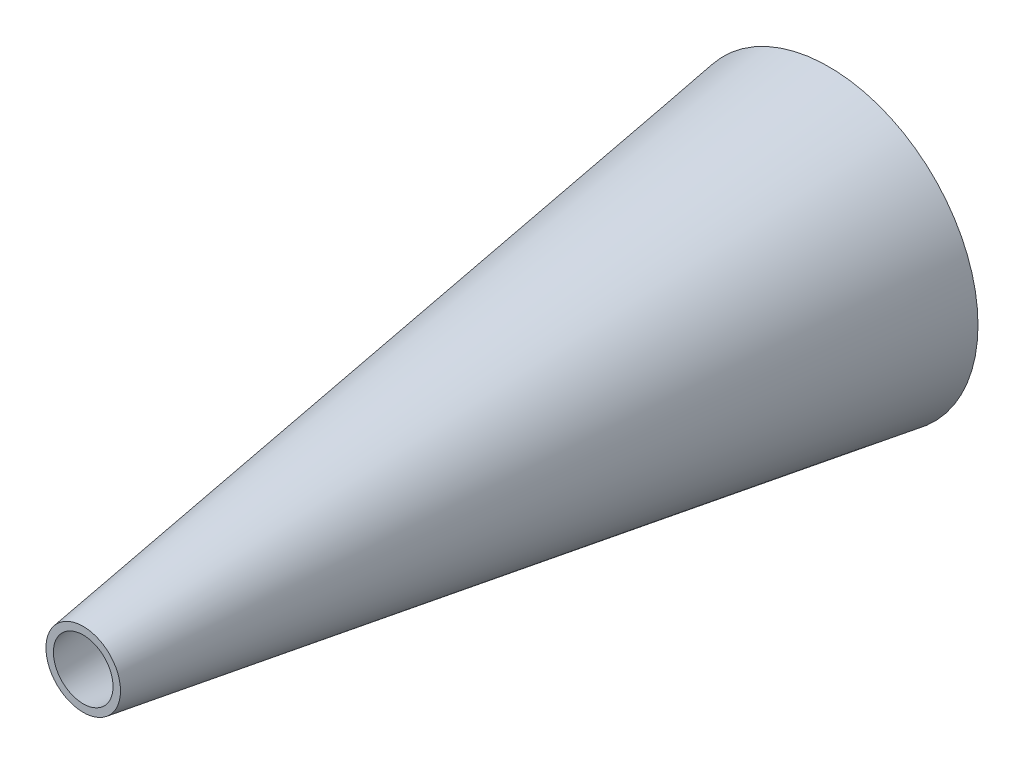
ISO-10303-21;
HEADER;
FILE_DESCRIPTION(('STEP AP214'),'2;1');
FILE_NAME('part.step','',(''),(''),'','','');
FILE_SCHEMA(('AUTOMOTIVE_DESIGN { 1 0 10303 214 1 1 1 1 }'));
ENDSEC;
DATA;
#1=APPLICATION_CONTEXT('core data for automotive mechanical design processes');
#2=APPLICATION_PROTOCOL_DEFINITION('international standard','automotive_design',2000,#1);
#3=PRODUCT_CONTEXT('',#1,'mechanical');
#4=PRODUCT('Part','Part','',(#3));
#5=PRODUCT_RELATED_PRODUCT_CATEGORY('part','',(#4));
#6=PRODUCT_DEFINITION_FORMATION('','',#4);
#7=PRODUCT_DEFINITION_CONTEXT('part definition',#1,'design');
#8=PRODUCT_DEFINITION('design','',#6,#7);
#9=PRODUCT_DEFINITION_SHAPE('','',#8);
#10=(LENGTH_UNIT() NAMED_UNIT(*) SI_UNIT(.MILLI.,.METRE.));
#11=(NAMED_UNIT(*) PLANE_ANGLE_UNIT() SI_UNIT($,.RADIAN.));
#12=(NAMED_UNIT(*) SI_UNIT($,.STERADIAN.) SOLID_ANGLE_UNIT());
#13=UNCERTAINTY_MEASURE_WITH_UNIT(LENGTH_MEASURE(1.E-05),#10,'distance_accuracy_value','');
#14=(GEOMETRIC_REPRESENTATION_CONTEXT(3) GLOBAL_UNCERTAINTY_ASSIGNED_CONTEXT((#13)) GLOBAL_UNIT_ASSIGNED_CONTEXT((#10,
#11,#12)) REPRESENTATION_CONTEXT('',''));
#15=CARTESIAN_POINT('',(0.,0.,0.));
#16=DIRECTION('',(0.,0.,1.));
#17=DIRECTION('',(1.,0.,0.));
#18=AXIS2_PLACEMENT_3D('',#15,#16,#17);
#19=CARTESIAN_POINT('',(0.,0.,500.));
#20=DIRECTION('',(0.,0.,-1.));
#21=DIRECTION('',(-1.,0.,0.));
#22=AXIS2_PLACEMENT_3D('',#19,#20,#21);
#23=CONICAL_SURFACE('',#22,20.,0.139095941482071);
#24=CARTESIAN_POINT('',(0.,0.,500.));
#25=DIRECTION('',(0.,0.,-1.));
#26=DIRECTION('',(1.,0.,0.));
#27=AXIS2_PLACEMENT_3D('',#24,#25,#26);
#28=CIRCLE('',#27,20.);
#29=CARTESIAN_POINT('',(20.,0.,500.));
#30=VERTEX_POINT('',#29);
#31=EDGE_CURVE('E26',#30,#30,#28,.T.);
#32=ORIENTED_EDGE('',*,*,#31,.F.);
#33=EDGE_LOOP('',(#32));
#34=FACE_BOUND('',#33,.T.);
#35=CARTESIAN_POINT('',(0.,0.,0.));
#36=DIRECTION('',(0.,0.,-1.));
#37=DIRECTION('',(1.,0.,0.));
#38=AXIS2_PLACEMENT_3D('',#35,#36,#37);
#39=CIRCLE('',#38,90.);
#40=CARTESIAN_POINT('',(90.,0.,0.));
#41=VERTEX_POINT('',#40);
#42=EDGE_CURVE('E10',#41,#41,#39,.T.);
#43=ORIENTED_EDGE('',*,*,#42,.T.);
#44=EDGE_LOOP('',(#43));
#45=FACE_BOUND('',#44,.T.);
#46=ADVANCED_FACE('F16',(#34,#45),#23,.F.);
#47=CARTESIAN_POINT('',(0.,0.,0.));
#48=DIRECTION('',(0.,0.,-1.));
#49=DIRECTION('',(0.,-1.,0.));
#50=AXIS2_PLACEMENT_3D('',#47,#48,#49);
#51=PLANE('',#50);
#52=CARTESIAN_POINT('',(0.,0.,0.));
#53=DIRECTION('',(0.,0.,1.));
#54=DIRECTION('',(1.,0.,0.));
#55=AXIS2_PLACEMENT_3D('',#52,#53,#54);
#56=CIRCLE('',#55,100.);
#57=CARTESIAN_POINT('',(100.,0.,0.));
#58=VERTEX_POINT('',#57);
#59=EDGE_CURVE('E19',#58,#58,#56,.T.);
#60=ORIENTED_EDGE('',*,*,#59,.F.);
#61=EDGE_LOOP('',(#60));
#62=FACE_BOUND('',#61,.T.);
#63=ORIENTED_EDGE('',*,*,#42,.F.);
#64=EDGE_LOOP('',(#63));
#65=FACE_BOUND('',#64,.T.);
#66=ADVANCED_FACE('F77',(#62,#65),#51,.T.);
#67=CARTESIAN_POINT('',(0.,0.,500.));
#68=DIRECTION('',(0.,0.,-1.));
#69=DIRECTION('',(0.,-1.,0.));
#70=AXIS2_PLACEMENT_3D('',#67,#68,#69);
#71=PLANE('',#70);
#72=CARTESIAN_POINT('',(0.,0.,500.));
#73=DIRECTION('',(0.,0.,1.));
#74=DIRECTION('',(1.,0.,0.));
#75=AXIS2_PLACEMENT_3D('',#72,#73,#74);
#76=CIRCLE('',#75,25.);
#77=CARTESIAN_POINT('',(25.,0.,500.));
#78=VERTEX_POINT('',#77);
#79=EDGE_CURVE('E44',#78,#78,#76,.T.);
#80=ORIENTED_EDGE('',*,*,#79,.T.);
#81=EDGE_LOOP('',(#80));
#82=FACE_BOUND('',#81,.T.);
#83=ORIENTED_EDGE('',*,*,#31,.T.);
#84=EDGE_LOOP('',(#83));
#85=FACE_BOUND('',#84,.T.);
#86=ADVANCED_FACE('F83',(#82,#85),#71,.F.);
#87=CARTESIAN_POINT('',(0.,0.,0.));
#88=DIRECTION('',(0.,0.,-1.));
#89=DIRECTION('',(-1.,0.,0.));
#90=AXIS2_PLACEMENT_3D('',#87,#88,#89);
#91=CONICAL_SURFACE('',#90,100.,0.148889947609497);
#92=ORIENTED_EDGE('',*,*,#59,.T.);
#93=EDGE_LOOP('',(#92));
#94=FACE_BOUND('',#93,.T.);
#95=ORIENTED_EDGE('',*,*,#79,.F.);
#96=EDGE_LOOP('',(#95));
#97=FACE_BOUND('',#96,.T.);
#98=ADVANCED_FACE('F51',(#94,#97),#91,.T.);
#99=CLOSED_SHELL('',(#46,#66,#86,#98));
#100=MANIFOLD_SOLID_BREP('B1',#99);
#101=ADVANCED_BREP_SHAPE_REPRESENTATION('',(#18,#100),#14);
#102=SHAPE_DEFINITION_REPRESENTATION(#9,#101);
ENDSEC;
END-ISO-10303-21;
